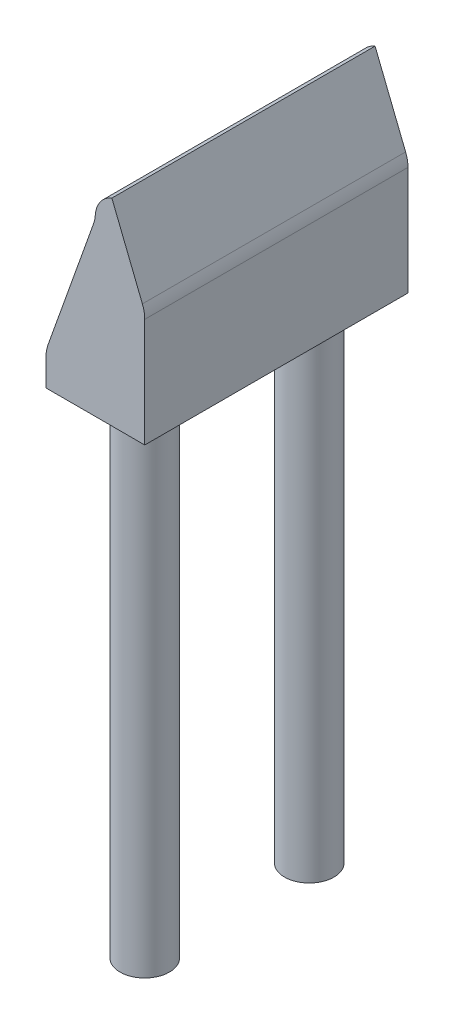
ISO-10303-21;
HEADER;
FILE_DESCRIPTION(('STEP AP214'),'2;1');
FILE_NAME('part.step','',(''),(''),'','','');
FILE_SCHEMA(('AUTOMOTIVE_DESIGN { 1 0 10303 214 1 1 1 1 }'));
ENDSEC;
DATA;
#1=APPLICATION_CONTEXT('core data for automotive mechanical design processes');
#2=APPLICATION_PROTOCOL_DEFINITION('international standard','automotive_design',2000,#1);
#3=PRODUCT_CONTEXT('',#1,'mechanical');
#4=PRODUCT('Part','Part','',(#3));
#5=PRODUCT_RELATED_PRODUCT_CATEGORY('part','',(#4));
#6=PRODUCT_DEFINITION_FORMATION('','',#4);
#7=PRODUCT_DEFINITION_CONTEXT('part definition',#1,'design');
#8=PRODUCT_DEFINITION('design','',#6,#7);
#9=PRODUCT_DEFINITION_SHAPE('','',#8);
#10=(LENGTH_UNIT() NAMED_UNIT(*) SI_UNIT(.MILLI.,.METRE.));
#11=(NAMED_UNIT(*) PLANE_ANGLE_UNIT() SI_UNIT($,.RADIAN.));
#12=(NAMED_UNIT(*) SI_UNIT($,.STERADIAN.) SOLID_ANGLE_UNIT());
#13=UNCERTAINTY_MEASURE_WITH_UNIT(LENGTH_MEASURE(1.E-05),#10,'distance_accuracy_value','');
#14=(GEOMETRIC_REPRESENTATION_CONTEXT(3) GLOBAL_UNCERTAINTY_ASSIGNED_CONTEXT((#13)) GLOBAL_UNIT_ASSIGNED_CONTEXT((#10,
#11,#12)) REPRESENTATION_CONTEXT('',''));
#15=CARTESIAN_POINT('',(0.,0.,0.));
#16=DIRECTION('',(0.,0.,1.));
#17=DIRECTION('',(1.,0.,0.));
#18=AXIS2_PLACEMENT_3D('',#15,#16,#17);
#19=CARTESIAN_POINT('',(0.,10.,0.));
#20=DIRECTION('',(-1.,0.,0.));
#21=DIRECTION('',(0.,0.,1.));
#22=AXIS2_PLACEMENT_3D('',#19,#20,#21);
#23=PLANE('',#22);
#24=DIRECTION('',(0.,-1.,0.));
#25=VECTOR('',#24,1.);
#26=CARTESIAN_POINT('',(0.,10.,-80.));
#27=LINE('',#26,#25);
#28=CARTESIAN_POINT('',(0.,33.0741759643276,-80.));
#29=VERTEX_POINT('',#28);
#30=CARTESIAN_POINT('',(0.,0.,-80.));
#31=VERTEX_POINT('',#30);
#32=EDGE_CURVE('E189',#29,#31,#27,.T.);
#33=ORIENTED_EDGE('',*,*,#32,.F.);
#34=DIRECTION('',(0.,0.,-1.));
#35=VECTOR('',#34,1.);
#36=CARTESIAN_POINT('',(0.,33.0741759643275,0.));
#37=LINE('',#36,#35);
#38=CARTESIAN_POINT('',(0.,33.0741759643275,0.));
#39=VERTEX_POINT('',#38);
#40=EDGE_CURVE('E198',#29,#39,#37,.F.);
#41=ORIENTED_EDGE('',*,*,#40,.T.);
#42=DIRECTION('',(0.,-1.,0.));
#43=VECTOR('',#42,1.);
#44=CARTESIAN_POINT('',(0.,10.,0.));
#45=LINE('',#44,#43);
#46=CARTESIAN_POINT('',(0.,0.,0.));
#47=VERTEX_POINT('',#46);
#48=EDGE_CURVE('E180',#39,#47,#45,.T.);
#49=ORIENTED_EDGE('',*,*,#48,.T.);
#50=DIRECTION('',(0.,0.,-1.));
#51=VECTOR('',#50,1.);
#52=CARTESIAN_POINT('',(0.,0.,0.));
#53=LINE('',#52,#51);
#54=EDGE_CURVE('E146',#47,#31,#53,.T.);
#55=ORIENTED_EDGE('',*,*,#54,.T.);
#56=EDGE_LOOP('',(#33,#41,#49,#55));
#57=FACE_BOUND('',#56,.T.);
#58=ADVANCED_FACE('F51',(#57),#23,.F.);
#59=CARTESIAN_POINT('',(0.,10.,-80.));
#60=DIRECTION('',(0.,0.,1.));
#61=DIRECTION('',(1.,0.,0.));
#62=AXIS2_PLACEMENT_3D('',#59,#60,#61);
#63=PLANE('',#62);
#64=DIRECTION('',(0.,-1.,0.));
#65=VECTOR('',#64,1.);
#66=CARTESIAN_POINT('',(-30.,10.,-80.));
#67=LINE('',#66,#65);
#68=CARTESIAN_POINT('',(-30.,8.26877451533461,-80.));
#69=VERTEX_POINT('',#68);
#70=CARTESIAN_POINT('',(-30.,0.,-80.));
#71=VERTEX_POINT('',#70);
#72=EDGE_CURVE('E186',#69,#71,#67,.T.);
#73=ORIENTED_EDGE('',*,*,#72,.F.);
#74=CARTESIAN_POINT('',(-20.,8.26877451533461,-80.));
#75=DIRECTION('',(0.,0.,1.));
#76=DIRECTION('',(1.,0.,0.));
#77=AXIS2_PLACEMENT_3D('',#74,#75,#76);
#78=CIRCLE('',#77,10.);
#79=CARTESIAN_POINT('',(-29.4180145914917,11.6304706875741,-80.));
#80=VERTEX_POINT('',#79);
#81=EDGE_CURVE('E223',#69,#80,#78,.F.);
#82=ORIENTED_EDGE('',*,*,#81,.T.);
#83=DIRECTION('',(0.33616961722395,0.941801459149169,0.));
#84=VECTOR('',#83,1.);
#85=CARTESIAN_POINT('',(-15.0083860178331,52.,-80.));
#86=LINE('',#85,#84);
#87=CARTESIAN_POINT('',(-15.5696689024794,50.4275288048915,-80.));
#88=VERTEX_POINT('',#87);
#89=EDGE_CURVE('E156',#80,#88,#86,.T.);
#90=ORIENTED_EDGE('',*,*,#89,.T.);
#91=CARTESIAN_POINT('',(-24.987683493971,53.789224977131,-80.));
#92=DIRECTION('',(0.,0.,1.));
#93=DIRECTION('',(1.,0.,0.));
#94=AXIS2_PLACEMENT_3D('',#91,#92,#93);
#95=CIRCLE('',#94,10.);
#96=CARTESIAN_POINT('',(-15.0105674357467,53.1130924747904,-80.));
#97=VERTEX_POINT('',#96);
#98=EDGE_CURVE('E209',#88,#97,#95,.T.);
#99=ORIENTED_EDGE('',*,*,#98,.T.);
#100=CARTESIAN_POINT('',(-7.02887458916716,52.5721864729179,-80.));
#101=DIRECTION('',(0.,0.,-1.));
#102=DIRECTION('',(1.,0.,0.));
#103=AXIS2_PLACEMENT_3D('',#100,#101,#102);
#104=CIRCLE('',#103,8.);
#105=CARTESIAN_POINT('',(-10.,60.,-80.));
#106=VERTEX_POINT('',#105);
#107=EDGE_CURVE('E159',#97,#106,#104,.T.);
#108=ORIENTED_EDGE('',*,*,#107,.T.);
#109=DIRECTION('',(0.371390676354105,-0.928476690885259,0.));
#110=VECTOR('',#109,1.);
#111=CARTESIAN_POINT('',(0.,35.,-80.));
#112=LINE('',#111,#110);
#113=CARTESIAN_POINT('',(-0.715233091147412,36.7880827278686,-80.));
#114=VERTEX_POINT('',#113);
#115=EDGE_CURVE('E144',#106,#114,#112,.T.);
#116=ORIENTED_EDGE('',*,*,#115,.T.);
#117=CARTESIAN_POINT('',(-10.,33.0741759643276,-80.));
#118=DIRECTION('',(0.,0.,1.));
#119=DIRECTION('',(1.,0.,0.));
#120=AXIS2_PLACEMENT_3D('',#117,#118,#119);
#121=CIRCLE('',#120,10.);
#122=EDGE_CURVE('E195',#114,#29,#121,.F.);
#123=ORIENTED_EDGE('',*,*,#122,.T.);
#124=ORIENTED_EDGE('',*,*,#32,.T.);
#125=DIRECTION('',(-1.,0.,0.));
#126=VECTOR('',#125,1.);
#127=CARTESIAN_POINT('',(0.,0.,-80.));
#128=LINE('',#127,#126);
#129=EDGE_CURVE('E168',#31,#71,#128,.T.);
#130=ORIENTED_EDGE('',*,*,#129,.T.);
#131=EDGE_LOOP('',(#73,#82,#90,#99,#108,#116,#123,#124,#130));
#132=FACE_BOUND('',#131,.T.);
#133=ADVANCED_FACE('F246',(#132),#63,.F.);
#134=CARTESIAN_POINT('',(-30.,10.,0.));
#135=DIRECTION('',(1.,0.,0.));
#136=DIRECTION('',(0.,0.,-1.));
#137=AXIS2_PLACEMENT_3D('',#134,#135,#136);
#138=PLANE('',#137);
#139=DIRECTION('',(0.,-1.,0.));
#140=VECTOR('',#139,1.);
#141=CARTESIAN_POINT('',(-30.,10.,0.));
#142=LINE('',#141,#140);
#143=CARTESIAN_POINT('',(-30.,8.26877451533471,0.));
#144=VERTEX_POINT('',#143);
#145=CARTESIAN_POINT('',(-30.,0.,0.));
#146=VERTEX_POINT('',#145);
#147=EDGE_CURVE('E183',#144,#146,#142,.T.);
#148=ORIENTED_EDGE('',*,*,#147,.F.);
#149=DIRECTION('',(0.,0.,1.));
#150=VECTOR('',#149,1.);
#151=CARTESIAN_POINT('',(-30.,8.26877451533461,-80.));
#152=LINE('',#151,#150);
#153=EDGE_CURVE('E67',#144,#69,#152,.F.);
#154=ORIENTED_EDGE('',*,*,#153,.T.);
#155=ORIENTED_EDGE('',*,*,#72,.T.);
#156=DIRECTION('',(0.,0.,1.));
#157=VECTOR('',#156,1.);
#158=CARTESIAN_POINT('',(-30.,0.,0.));
#159=LINE('',#158,#157);
#160=EDGE_CURVE('E172',#71,#146,#159,.T.);
#161=ORIENTED_EDGE('',*,*,#160,.T.);
#162=EDGE_LOOP('',(#148,#154,#155,#161));
#163=FACE_BOUND('',#162,.T.);
#164=ADVANCED_FACE('F243',(#163),#138,.F.);
#165=CARTESIAN_POINT('',(0.,10.,0.));
#166=DIRECTION('',(0.,0.,-1.));
#167=DIRECTION('',(-1.,0.,0.));
#168=AXIS2_PLACEMENT_3D('',#165,#166,#167);
#169=PLANE('',#168);
#170=DIRECTION('',(0.33616961722395,0.941801459149169,0.));
#171=VECTOR('',#170,1.);
#172=CARTESIAN_POINT('',(-15.0083860178331,52.,0.));
#173=LINE('',#172,#171);
#174=CARTESIAN_POINT('',(-29.4180145914917,11.6304706875742,0.));
#175=VERTEX_POINT('',#174);
#176=CARTESIAN_POINT('',(-15.5696689024794,50.4275288048915,0.));
#177=VERTEX_POINT('',#176);
#178=EDGE_CURVE('E136',#175,#177,#173,.T.);
#179=ORIENTED_EDGE('',*,*,#178,.F.);
#180=CARTESIAN_POINT('',(-20.,8.26877451533471,0.));
#181=DIRECTION('',(0.,0.,-1.));
#182=DIRECTION('',(-1.,0.,0.));
#183=AXIS2_PLACEMENT_3D('',#180,#181,#182);
#184=CIRCLE('',#183,10.);
#185=EDGE_CURVE('E75',#175,#144,#184,.F.);
#186=ORIENTED_EDGE('',*,*,#185,.T.);
#187=ORIENTED_EDGE('',*,*,#147,.T.);
#188=DIRECTION('',(1.,0.,0.));
#189=VECTOR('',#188,1.);
#190=CARTESIAN_POINT('',(0.,0.,0.));
#191=LINE('',#190,#189);
#192=EDGE_CURVE('E176',#146,#47,#191,.T.);
#193=ORIENTED_EDGE('',*,*,#192,.T.);
#194=ORIENTED_EDGE('',*,*,#48,.F.);
#195=CARTESIAN_POINT('',(-10.,33.0741759643275,0.));
#196=DIRECTION('',(0.,0.,-1.));
#197=DIRECTION('',(-1.,0.,0.));
#198=AXIS2_PLACEMENT_3D('',#195,#196,#197);
#199=CIRCLE('',#198,10.);
#200=CARTESIAN_POINT('',(-0.715233091147413,36.7880827278685,0.));
#201=VERTEX_POINT('',#200);
#202=EDGE_CURVE('E151',#39,#201,#199,.F.);
#203=ORIENTED_EDGE('',*,*,#202,.T.);
#204=DIRECTION('',(0.371390676354105,-0.928476690885259,0.));
#205=VECTOR('',#204,1.);
#206=CARTESIAN_POINT('',(0.,35.,0.));
#207=LINE('',#206,#205);
#208=CARTESIAN_POINT('',(-10.,60.,0.));
#209=VERTEX_POINT('',#208);
#210=EDGE_CURVE('E135',#209,#201,#207,.T.);
#211=ORIENTED_EDGE('',*,*,#210,.F.);
#212=CARTESIAN_POINT('',(-7.0288745891672,52.5721864729179,0.));
#213=DIRECTION('',(0.,0.,-1.));
#214=DIRECTION('',(1.,0.,0.));
#215=AXIS2_PLACEMENT_3D('',#212,#213,#214);
#216=CIRCLE('',#215,8.);
#217=CARTESIAN_POINT('',(-15.0105674357467,53.1130924747904,0.));
#218=VERTEX_POINT('',#217);
#219=EDGE_CURVE('E123',#218,#209,#216,.T.);
#220=ORIENTED_EDGE('',*,*,#219,.F.);
#221=CARTESIAN_POINT('',(-24.9876834939711,53.789224977131,0.));
#222=DIRECTION('',(0.,0.,-1.));
#223=DIRECTION('',(-1.,0.,0.));
#224=AXIS2_PLACEMENT_3D('',#221,#222,#223);
#225=CIRCLE('',#224,10.);
#226=EDGE_CURVE('E212',#218,#177,#225,.T.);
#227=ORIENTED_EDGE('',*,*,#226,.T.);
#228=EDGE_LOOP('',(#179,#186,#187,#193,#194,#203,#211,#220,#227));
#229=FACE_BOUND('',#228,.T.);
#230=ADVANCED_FACE('F148',(#229),#169,.F.);
#231=CARTESIAN_POINT('',(0.,0.,0.));
#232=DIRECTION('',(0.,1.,0.));
#233=DIRECTION('',(0.,0.,1.));
#234=AXIS2_PLACEMENT_3D('',#231,#232,#233);
#235=PLANE('',#234);
#236=CARTESIAN_POINT('',(-15.,0.,-15.));
#237=DIRECTION('',(0.,1.,0.));
#238=DIRECTION('',(0.,0.,1.));
#239=AXIS2_PLACEMENT_3D('',#236,#237,#238);
#240=CIRCLE('',#239,7.5);
#241=CARTESIAN_POINT('',(-15.,0.,-7.5));
#242=VERTEX_POINT('',#241);
#243=EDGE_CURVE('E11',#242,#242,#240,.F.);
#244=ORIENTED_EDGE('',*,*,#243,.F.);
#245=EDGE_LOOP('',(#244));
#246=FACE_BOUND('',#245,.T.);
#247=CARTESIAN_POINT('',(-15.,0.,-65.));
#248=DIRECTION('',(0.,1.,0.));
#249=DIRECTION('',(0.,0.,1.));
#250=AXIS2_PLACEMENT_3D('',#247,#248,#249);
#251=CIRCLE('',#250,7.50000000000001);
#252=CARTESIAN_POINT('',(-15.,0.,-57.5));
#253=VERTEX_POINT('',#252);
#254=EDGE_CURVE('E60',#253,#253,#251,.F.);
#255=ORIENTED_EDGE('',*,*,#254,.F.);
#256=EDGE_LOOP('',(#255));
#257=FACE_BOUND('',#256,.T.);
#258=ORIENTED_EDGE('',*,*,#54,.F.);
#259=ORIENTED_EDGE('',*,*,#192,.F.);
#260=ORIENTED_EDGE('',*,*,#160,.F.);
#261=ORIENTED_EDGE('',*,*,#129,.F.);
#262=EDGE_LOOP('',(#258,#259,#260,#261));
#263=FACE_BOUND('',#262,.T.);
#264=ADVANCED_FACE('F231',(#246,#257,#263),#235,.F.);
#265=CARTESIAN_POINT('',(0.,35.,0.));
#266=DIRECTION('',(0.928476690885259,0.371390676354105,0.));
#267=DIRECTION('',(-0.371390676354105,0.928476690885259,0.));
#268=AXIS2_PLACEMENT_3D('',#265,#266,#267);
#269=PLANE('',#268);
#270=ORIENTED_EDGE('',*,*,#210,.T.);
#271=DIRECTION('',(0.,0.,-1.));
#272=VECTOR('',#271,1.);
#273=CARTESIAN_POINT('',(-0.715233091147412,36.7880827278686,-80.));
#274=LINE('',#273,#272);
#275=EDGE_CURVE('E192',#201,#114,#274,.T.);
#276=ORIENTED_EDGE('',*,*,#275,.T.);
#277=ORIENTED_EDGE('',*,*,#115,.F.);
#278=DIRECTION('',(0.,0.,-1.));
#279=VECTOR('',#278,1.);
#280=CARTESIAN_POINT('',(-10.,60.,0.));
#281=LINE('',#280,#279);
#282=EDGE_CURVE('E127',#209,#106,#281,.T.);
#283=ORIENTED_EDGE('',*,*,#282,.F.);
#284=EDGE_LOOP('',(#270,#276,#277,#283));
#285=FACE_BOUND('',#284,.T.);
#286=ADVANCED_FACE('F140',(#285),#269,.T.);
#287=CARTESIAN_POINT('',(-7.0288745891672,52.5721864729179,0.));
#288=DIRECTION('',(0.,0.,-1.));
#289=DIRECTION('',(-1.,0.,0.));
#290=AXIS2_PLACEMENT_3D('',#287,#288,#289);
#291=CYLINDRICAL_SURFACE('',#290,8.);
#292=ORIENTED_EDGE('',*,*,#107,.F.);
#293=DIRECTION('',(0.,0.,-1.));
#294=VECTOR('',#293,1.);
#295=CARTESIAN_POINT('',(-15.0105674357467,53.1130924747904,0.));
#296=LINE('',#295,#294);
#297=EDGE_CURVE('E130',#97,#218,#296,.F.);
#298=ORIENTED_EDGE('',*,*,#297,.T.);
#299=ORIENTED_EDGE('',*,*,#219,.T.);
#300=ORIENTED_EDGE('',*,*,#282,.T.);
#301=EDGE_LOOP('',(#292,#298,#299,#300));
#302=FACE_BOUND('',#301,.T.);
#303=ADVANCED_FACE('F126',(#302),#291,.T.);
#304=CARTESIAN_POINT('',(-15.0083860178331,52.,0.));
#305=DIRECTION('',(-0.941801459149169,0.33616961722395,0.));
#306=DIRECTION('',(-0.33616961722395,-0.941801459149169,0.));
#307=AXIS2_PLACEMENT_3D('',#304,#305,#306);
#308=PLANE('',#307);
#309=ORIENTED_EDGE('',*,*,#89,.F.);
#310=DIRECTION('',(0.,0.,1.));
#311=VECTOR('',#310,1.);
#312=CARTESIAN_POINT('',(-29.4180145914917,11.6304706875742,0.));
#313=LINE('',#312,#311);
#314=EDGE_CURVE('E215',#80,#175,#313,.T.);
#315=ORIENTED_EDGE('',*,*,#314,.T.);
#316=ORIENTED_EDGE('',*,*,#178,.T.);
#317=DIRECTION('',(0.,0.,1.));
#318=VECTOR('',#317,1.);
#319=CARTESIAN_POINT('',(-15.5696689024794,50.4275288048915,-80.));
#320=LINE('',#319,#318);
#321=EDGE_CURVE('E203',#177,#88,#320,.F.);
#322=ORIENTED_EDGE('',*,*,#321,.T.);
#323=EDGE_LOOP('',(#309,#315,#316,#322));
#324=FACE_BOUND('',#323,.T.);
#325=ADVANCED_FACE('F251',(#324),#308,.T.);
#326=CARTESIAN_POINT('',(-10.,33.0741759643275,0.));
#327=DIRECTION('',(0.,0.,1.));
#328=DIRECTION('',(0.,-1.,0.));
#329=AXIS2_PLACEMENT_3D('',#326,#327,#328);
#330=CYLINDRICAL_SURFACE('',#329,10.);
#331=ORIENTED_EDGE('',*,*,#202,.F.);
#332=ORIENTED_EDGE('',*,*,#40,.F.);
#333=ORIENTED_EDGE('',*,*,#122,.F.);
#334=ORIENTED_EDGE('',*,*,#275,.F.);
#335=EDGE_LOOP('',(#331,#332,#333,#334));
#336=FACE_BOUND('',#335,.T.);
#337=ADVANCED_FACE('F248',(#336),#330,.T.);
#338=CARTESIAN_POINT('',(-24.9876834939711,53.789224977131,0.));
#339=DIRECTION('',(0.,0.,-1.));
#340=DIRECTION('',(-1.,0.,0.));
#341=AXIS2_PLACEMENT_3D('',#338,#339,#340);
#342=CYLINDRICAL_SURFACE('',#341,10.);
#343=ORIENTED_EDGE('',*,*,#226,.F.);
#344=ORIENTED_EDGE('',*,*,#297,.F.);
#345=ORIENTED_EDGE('',*,*,#98,.F.);
#346=ORIENTED_EDGE('',*,*,#321,.F.);
#347=EDGE_LOOP('',(#343,#344,#345,#346));
#348=FACE_BOUND('',#347,.T.);
#349=ADVANCED_FACE('F250',(#348),#342,.F.);
#350=CARTESIAN_POINT('',(-20.,8.26877451533471,0.));
#351=DIRECTION('',(0.,0.,-1.));
#352=DIRECTION('',(0.,1.,0.));
#353=AXIS2_PLACEMENT_3D('',#350,#351,#352);
#354=CYLINDRICAL_SURFACE('',#353,10.);
#355=ORIENTED_EDGE('',*,*,#81,.F.);
#356=ORIENTED_EDGE('',*,*,#153,.F.);
#357=ORIENTED_EDGE('',*,*,#185,.F.);
#358=ORIENTED_EDGE('',*,*,#314,.F.);
#359=EDGE_LOOP('',(#355,#356,#357,#358));
#360=FACE_BOUND('',#359,.T.);
#361=ADVANCED_FACE('F53',(#360),#354,.T.);
#362=CARTESIAN_POINT('',(-15.,-150.,-65.));
#363=DIRECTION('',(0.,1.,0.));
#364=DIRECTION('',(0.,0.,1.));
#365=AXIS2_PLACEMENT_3D('',#362,#363,#364);
#366=CYLINDRICAL_SURFACE('',#365,7.50000000000001);
#367=CARTESIAN_POINT('',(-15.,-150.,-65.));
#368=DIRECTION('',(0.,-1.,0.));
#369=DIRECTION('',(0.,0.,-1.));
#370=AXIS2_PLACEMENT_3D('',#367,#368,#369);
#371=CIRCLE('',#370,7.50000000000001);
#372=CARTESIAN_POINT('',(-15.,-150.,-72.5));
#373=VERTEX_POINT('',#372);
#374=EDGE_CURVE('E294',#373,#373,#371,.T.);
#375=ORIENTED_EDGE('',*,*,#374,.F.);
#376=EDGE_LOOP('',(#375));
#377=FACE_BOUND('',#376,.T.);
#378=ORIENTED_EDGE('',*,*,#254,.T.);
#379=EDGE_LOOP('',(#378));
#380=FACE_BOUND('',#379,.T.);
#381=ADVANCED_FACE('F229',(#377,#380),#366,.T.);
#382=CARTESIAN_POINT('',(-15.,-150.,-65.));
#383=DIRECTION('',(0.,-1.,0.));
#384=DIRECTION('',(0.,0.,-1.));
#385=AXIS2_PLACEMENT_3D('',#382,#383,#384);
#386=PLANE('',#385);
#387=ORIENTED_EDGE('',*,*,#374,.T.);
#388=EDGE_LOOP('',(#387));
#389=FACE_BOUND('',#388,.T.);
#390=ADVANCED_FACE('F275',(#389),#386,.T.);
#391=CARTESIAN_POINT('',(-15.,-150.,-15.));
#392=DIRECTION('',(0.,1.,0.));
#393=DIRECTION('',(0.,0.,1.));
#394=AXIS2_PLACEMENT_3D('',#391,#392,#393);
#395=CYLINDRICAL_SURFACE('',#394,7.5);
#396=CARTESIAN_POINT('',(-15.,-150.,-15.));
#397=DIRECTION('',(0.,-1.,0.));
#398=DIRECTION('',(0.,0.,-1.));
#399=AXIS2_PLACEMENT_3D('',#396,#397,#398);
#400=CIRCLE('',#399,7.5);
#401=CARTESIAN_POINT('',(-15.,-150.,-22.5));
#402=VERTEX_POINT('',#401);
#403=EDGE_CURVE('E160',#402,#402,#400,.T.);
#404=ORIENTED_EDGE('',*,*,#403,.F.);
#405=EDGE_LOOP('',(#404));
#406=FACE_BOUND('',#405,.T.);
#407=ORIENTED_EDGE('',*,*,#243,.T.);
#408=EDGE_LOOP('',(#407));
#409=FACE_BOUND('',#408,.T.);
#410=ADVANCED_FACE('F278',(#406,#409),#395,.T.);
#411=CARTESIAN_POINT('',(-15.,-150.,-15.));
#412=DIRECTION('',(0.,-1.,0.));
#413=DIRECTION('',(0.,0.,-1.));
#414=AXIS2_PLACEMENT_3D('',#411,#412,#413);
#415=PLANE('',#414);
#416=ORIENTED_EDGE('',*,*,#403,.T.);
#417=EDGE_LOOP('',(#416));
#418=FACE_BOUND('',#417,.T.);
#419=ADVANCED_FACE('F285',(#418),#415,.T.);
#420=CLOSED_SHELL('',(#58,#133,#164,#230,#264,#286,#303,#325,#337,#349,#361,#381,#390,#410,#419));
#421=MANIFOLD_SOLID_BREP('B2',#420);
#422=ADVANCED_BREP_SHAPE_REPRESENTATION('',(#18,#421),#14);
#423=SHAPE_DEFINITION_REPRESENTATION(#9,#422);
ENDSEC;
END-ISO-10303-21;
